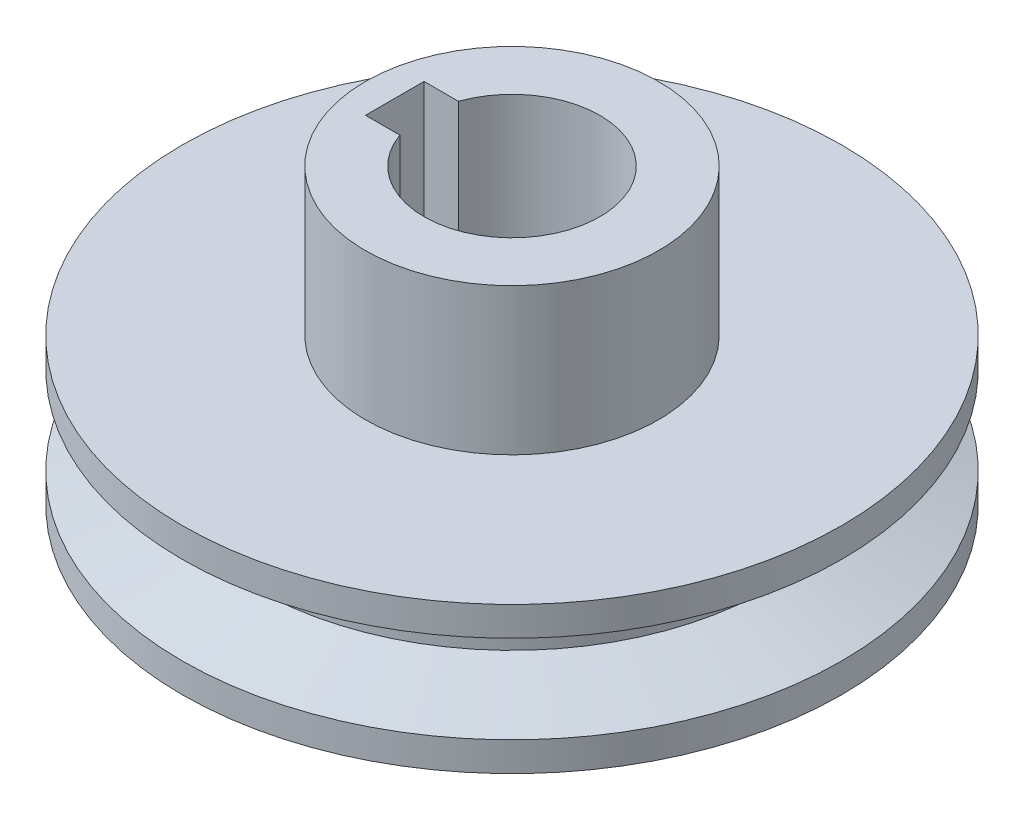
ISO-10303-21;
HEADER;
FILE_DESCRIPTION(('STEP AP214'),'2;1');
FILE_NAME('part.step','',(''),(''),'','','');
FILE_SCHEMA(('AUTOMOTIVE_DESIGN { 1 0 10303 214 1 1 1 1 }'));
ENDSEC;
DATA;
#1=APPLICATION_CONTEXT('core data for automotive mechanical design processes');
#2=APPLICATION_PROTOCOL_DEFINITION('international standard','automotive_design',2000,#1);
#3=PRODUCT_CONTEXT('',#1,'mechanical');
#4=PRODUCT('Part','Part','',(#3));
#5=PRODUCT_RELATED_PRODUCT_CATEGORY('part','',(#4));
#6=PRODUCT_DEFINITION_FORMATION('','',#4);
#7=PRODUCT_DEFINITION_CONTEXT('part definition',#1,'design');
#8=PRODUCT_DEFINITION('design','',#6,#7);
#9=PRODUCT_DEFINITION_SHAPE('','',#8);
#10=(LENGTH_UNIT() NAMED_UNIT(*) SI_UNIT(.MILLI.,.METRE.));
#11=(NAMED_UNIT(*) PLANE_ANGLE_UNIT() SI_UNIT($,.RADIAN.));
#12=(NAMED_UNIT(*) SI_UNIT($,.STERADIAN.) SOLID_ANGLE_UNIT());
#13=UNCERTAINTY_MEASURE_WITH_UNIT(LENGTH_MEASURE(1.E-05),#10,'distance_accuracy_value','');
#14=(GEOMETRIC_REPRESENTATION_CONTEXT(3) GLOBAL_UNCERTAINTY_ASSIGNED_CONTEXT((#13)) GLOBAL_UNIT_ASSIGNED_CONTEXT((#10,
#11,#12)) REPRESENTATION_CONTEXT('',''));
#15=CARTESIAN_POINT('',(0.,0.,0.));
#16=DIRECTION('',(0.,0.,1.));
#17=DIRECTION('',(1.,0.,0.));
#18=AXIS2_PLACEMENT_3D('',#15,#16,#17);
#19=CARTESIAN_POINT('',(22.5,43.956272640616,0.));
#20=DIRECTION('',(0.,1.,0.));
#21=DIRECTION('',(-1.,0.,0.));
#22=AXIS2_PLACEMENT_3D('',#19,#20,#21);
#23=CYLINDRICAL_SURFACE('',#22,45.);
#24=CARTESIAN_POINT('',(22.5,-9.99999999999999,0.));
#25=DIRECTION('',(0.,1.,0.));
#26=DIRECTION('',(-1.,0.,0.));
#27=AXIS2_PLACEMENT_3D('',#24,#25,#26);
#28=CIRCLE('',#27,45.);
#29=CARTESIAN_POINT('',(-22.5,-10.,0.));
#30=VERTEX_POINT('',#29);
#31=EDGE_CURVE('E101',#30,#30,#28,.T.);
#32=ORIENTED_EDGE('',*,*,#31,.T.);
#33=EDGE_LOOP('',(#32));
#34=FACE_BOUND('',#33,.T.);
#35=CARTESIAN_POINT('',(22.5,-5.99999999999999,0.));
#36=DIRECTION('',(0.,1.,0.));
#37=DIRECTION('',(-1.,0.,0.));
#38=AXIS2_PLACEMENT_3D('',#35,#36,#37);
#39=CIRCLE('',#38,45.);
#40=CARTESIAN_POINT('',(-22.5,-6.,0.));
#41=VERTEX_POINT('',#40);
#42=EDGE_CURVE('E124',#41,#41,#39,.T.);
#43=ORIENTED_EDGE('',*,*,#42,.F.);
#44=EDGE_LOOP('',(#43));
#45=FACE_BOUND('',#44,.T.);
#46=ADVANCED_FACE('F33',(#34,#45),#23,.T.);
#47=CARTESIAN_POINT('',(22.5,-2.49999999999999,0.));
#48=DIRECTION('',(0.,-1.,0.));
#49=DIRECTION('',(1.,0.,0.));
#50=AXIS2_PLACEMENT_3D('',#47,#48,#49);
#51=CONICAL_SURFACE('',#50,35.,1.23412150740817);
#52=ORIENTED_EDGE('',*,*,#42,.T.);
#53=EDGE_LOOP('',(#52));
#54=FACE_BOUND('',#53,.T.);
#55=CARTESIAN_POINT('',(22.5,-2.49999999999999,0.));
#56=DIRECTION('',(0.,1.,0.));
#57=DIRECTION('',(-1.,0.,0.));
#58=AXIS2_PLACEMENT_3D('',#55,#56,#57);
#59=CIRCLE('',#58,35.);
#60=CARTESIAN_POINT('',(-12.5,-2.49999999999999,0.));
#61=VERTEX_POINT('',#60);
#62=EDGE_CURVE('E121',#61,#61,#59,.T.);
#63=ORIENTED_EDGE('',*,*,#62,.F.);
#64=EDGE_LOOP('',(#63));
#65=FACE_BOUND('',#64,.T.);
#66=ADVANCED_FACE('F144',(#54,#65),#51,.T.);
#67=CARTESIAN_POINT('',(22.5,43.956272640616,0.));
#68=DIRECTION('',(0.,1.,0.));
#69=DIRECTION('',(-1.,0.,0.));
#70=AXIS2_PLACEMENT_3D('',#67,#68,#69);
#71=CYLINDRICAL_SURFACE('',#70,35.);
#72=ORIENTED_EDGE('',*,*,#62,.T.);
#73=EDGE_LOOP('',(#72));
#74=FACE_BOUND('',#73,.T.);
#75=CARTESIAN_POINT('',(22.5,2.50000000000001,0.));
#76=DIRECTION('',(0.,1.,0.));
#77=DIRECTION('',(-1.,0.,0.));
#78=AXIS2_PLACEMENT_3D('',#75,#76,#77);
#79=CIRCLE('',#78,35.);
#80=CARTESIAN_POINT('',(-12.5,2.50000000000001,0.));
#81=VERTEX_POINT('',#80);
#82=EDGE_CURVE('E118',#81,#81,#79,.T.);
#83=ORIENTED_EDGE('',*,*,#82,.F.);
#84=EDGE_LOOP('',(#83));
#85=FACE_BOUND('',#84,.T.);
#86=ADVANCED_FACE('F149',(#74,#85),#71,.T.);
#87=CARTESIAN_POINT('',(22.5,6.00000000000001,0.));
#88=DIRECTION('',(0.,1.,0.));
#89=DIRECTION('',(-1.,0.,0.));
#90=AXIS2_PLACEMENT_3D('',#87,#88,#89);
#91=CONICAL_SURFACE('',#90,45.,1.23412150740817);
#92=ORIENTED_EDGE('',*,*,#82,.T.);
#93=EDGE_LOOP('',(#92));
#94=FACE_BOUND('',#93,.T.);
#95=CARTESIAN_POINT('',(22.5,6.00000000000001,0.));
#96=DIRECTION('',(0.,1.,0.));
#97=DIRECTION('',(-1.,0.,0.));
#98=AXIS2_PLACEMENT_3D('',#95,#96,#97);
#99=CIRCLE('',#98,45.);
#100=CARTESIAN_POINT('',(-22.5,6.00000000000001,0.));
#101=VERTEX_POINT('',#100);
#102=EDGE_CURVE('E115',#101,#101,#99,.T.);
#103=ORIENTED_EDGE('',*,*,#102,.F.);
#104=EDGE_LOOP('',(#103));
#105=FACE_BOUND('',#104,.T.);
#106=ADVANCED_FACE('F159',(#94,#105),#91,.T.);
#107=CARTESIAN_POINT('',(22.5,43.956272640616,0.));
#108=DIRECTION('',(0.,1.,0.));
#109=DIRECTION('',(-1.,0.,0.));
#110=AXIS2_PLACEMENT_3D('',#107,#108,#109);
#111=CYLINDRICAL_SURFACE('',#110,45.);
#112=ORIENTED_EDGE('',*,*,#102,.T.);
#113=EDGE_LOOP('',(#112));
#114=FACE_BOUND('',#113,.T.);
#115=CARTESIAN_POINT('',(22.5,10.,0.));
#116=DIRECTION('',(0.,1.,0.));
#117=DIRECTION('',(-1.,0.,0.));
#118=AXIS2_PLACEMENT_3D('',#115,#116,#117);
#119=CIRCLE('',#118,45.);
#120=CARTESIAN_POINT('',(-22.5,10.,0.));
#121=VERTEX_POINT('',#120);
#122=EDGE_CURVE('E112',#121,#121,#119,.T.);
#123=ORIENTED_EDGE('',*,*,#122,.F.);
#124=EDGE_LOOP('',(#123));
#125=FACE_BOUND('',#124,.T.);
#126=ADVANCED_FACE('F165',(#114,#125),#111,.T.);
#127=CARTESIAN_POINT('',(2.5,10.,0.));
#128=DIRECTION('',(0.,1.,0.));
#129=DIRECTION('',(-1.,0.,0.));
#130=AXIS2_PLACEMENT_3D('',#127,#128,#129);
#131=PLANE('',#130);
#132=ORIENTED_EDGE('',*,*,#122,.T.);
#133=EDGE_LOOP('',(#132));
#134=FACE_BOUND('',#133,.T.);
#135=CARTESIAN_POINT('',(22.5,10.,0.));
#136=DIRECTION('',(0.,1.,0.));
#137=DIRECTION('',(-1.,0.,0.));
#138=AXIS2_PLACEMENT_3D('',#135,#136,#137);
#139=CIRCLE('',#138,20.);
#140=CARTESIAN_POINT('',(2.5,10.,0.));
#141=VERTEX_POINT('',#140);
#142=EDGE_CURVE('E109',#141,#141,#139,.T.);
#143=ORIENTED_EDGE('',*,*,#142,.F.);
#144=EDGE_LOOP('',(#143));
#145=FACE_BOUND('',#144,.T.);
#146=ADVANCED_FACE('F171',(#134,#145),#131,.T.);
#147=CARTESIAN_POINT('',(22.5,43.956272640616,0.));
#148=DIRECTION('',(0.,1.,0.));
#149=DIRECTION('',(-1.,0.,0.));
#150=AXIS2_PLACEMENT_3D('',#147,#148,#149);
#151=CYLINDRICAL_SURFACE('',#150,20.);
#152=ORIENTED_EDGE('',*,*,#142,.T.);
#153=EDGE_LOOP('',(#152));
#154=FACE_BOUND('',#153,.T.);
#155=CARTESIAN_POINT('',(22.5,30.,0.));
#156=DIRECTION('',(0.,1.,0.));
#157=DIRECTION('',(-1.,0.,0.));
#158=AXIS2_PLACEMENT_3D('',#155,#156,#157);
#159=CIRCLE('',#158,20.);
#160=CARTESIAN_POINT('',(2.5,30.,0.));
#161=VERTEX_POINT('',#160);
#162=EDGE_CURVE('E106',#161,#161,#159,.T.);
#163=ORIENTED_EDGE('',*,*,#162,.F.);
#164=EDGE_LOOP('',(#163));
#165=FACE_BOUND('',#164,.T.);
#166=ADVANCED_FACE('F177',(#154,#165),#151,.T.);
#167=CARTESIAN_POINT('',(2.5,30.,0.));
#168=DIRECTION('',(0.,1.,0.));
#169=DIRECTION('',(-1.,0.,0.));
#170=AXIS2_PLACEMENT_3D('',#167,#168,#169);
#171=PLANE('',#170);
#172=DIRECTION('',(-1.,0.,0.));
#173=VECTOR('',#172,1.);
#174=CARTESIAN_POINT('',(22.5,30.,-4.));
#175=LINE('',#174,#173);
#176=CARTESIAN_POINT('',(11.1862915010152,30.,-4.));
#177=VERTEX_POINT('',#176);
#178=CARTESIAN_POINT('',(6.5,30.,-4.));
#179=VERTEX_POINT('',#178);
#180=EDGE_CURVE('E90',#177,#179,#175,.T.);
#181=ORIENTED_EDGE('',*,*,#180,.F.);
#182=CARTESIAN_POINT('',(22.5,30.,0.));
#183=DIRECTION('',(0.,1.,0.));
#184=DIRECTION('',(-1.,0.,0.));
#185=AXIS2_PLACEMENT_3D('',#182,#183,#184);
#186=CIRCLE('',#185,12.);
#187=CARTESIAN_POINT('',(11.1862915010152,30.,4.));
#188=VERTEX_POINT('',#187);
#189=EDGE_CURVE('E97',#188,#177,#186,.T.);
#190=ORIENTED_EDGE('',*,*,#189,.F.);
#191=DIRECTION('',(1.,0.,0.));
#192=VECTOR('',#191,1.);
#193=CARTESIAN_POINT('',(22.5,30.,4.));
#194=LINE('',#193,#192);
#195=CARTESIAN_POINT('',(6.5,30.,4.));
#196=VERTEX_POINT('',#195);
#197=EDGE_CURVE('E47',#196,#188,#194,.T.);
#198=ORIENTED_EDGE('',*,*,#197,.F.);
#199=DIRECTION('',(0.,0.,1.));
#200=VECTOR('',#199,1.);
#201=CARTESIAN_POINT('',(6.5,30.,4.));
#202=LINE('',#201,#200);
#203=EDGE_CURVE('E78',#179,#196,#202,.T.);
#204=ORIENTED_EDGE('',*,*,#203,.F.);
#205=EDGE_LOOP('',(#181,#190,#198,#204));
#206=FACE_BOUND('',#205,.T.);
#207=ORIENTED_EDGE('',*,*,#162,.T.);
#208=EDGE_LOOP('',(#207));
#209=FACE_BOUND('',#208,.T.);
#210=ADVANCED_FACE('F131',(#206,#209),#171,.T.);
#211=CARTESIAN_POINT('',(22.5,-10.,0.));
#212=DIRECTION('',(0.,-1.,0.));
#213=DIRECTION('',(1.,0.,0.));
#214=AXIS2_PLACEMENT_3D('',#211,#212,#213);
#215=PLANE('',#214);
#216=DIRECTION('',(-1.,0.,0.));
#217=VECTOR('',#216,1.);
#218=CARTESIAN_POINT('',(22.5,-10.,-4.));
#219=LINE('',#218,#217);
#220=CARTESIAN_POINT('',(11.1862915010152,-10.,-4.));
#221=VERTEX_POINT('',#220);
#222=CARTESIAN_POINT('',(6.5,-10.,-4.));
#223=VERTEX_POINT('',#222);
#224=EDGE_CURVE('E80',#221,#223,#219,.T.);
#225=ORIENTED_EDGE('',*,*,#224,.T.);
#226=DIRECTION('',(0.,0.,1.));
#227=VECTOR('',#226,1.);
#228=CARTESIAN_POINT('',(6.5,-10.,4.));
#229=LINE('',#228,#227);
#230=CARTESIAN_POINT('',(6.5,-10.,4.));
#231=VERTEX_POINT('',#230);
#232=EDGE_CURVE('E75',#223,#231,#229,.T.);
#233=ORIENTED_EDGE('',*,*,#232,.T.);
#234=DIRECTION('',(1.,0.,0.));
#235=VECTOR('',#234,1.);
#236=CARTESIAN_POINT('',(22.5,-10.,4.));
#237=LINE('',#236,#235);
#238=CARTESIAN_POINT('',(11.1862915010152,-10.,4.));
#239=VERTEX_POINT('',#238);
#240=EDGE_CURVE('E82',#231,#239,#237,.T.);
#241=ORIENTED_EDGE('',*,*,#240,.T.);
#242=CARTESIAN_POINT('',(22.5,-10.,0.));
#243=DIRECTION('',(0.,1.,0.));
#244=DIRECTION('',(-1.,0.,0.));
#245=AXIS2_PLACEMENT_3D('',#242,#243,#244);
#246=CIRCLE('',#245,12.);
#247=EDGE_CURVE('E99',#239,#221,#246,.T.);
#248=ORIENTED_EDGE('',*,*,#247,.T.);
#249=EDGE_LOOP('',(#225,#233,#241,#248));
#250=FACE_BOUND('',#249,.T.);
#251=ORIENTED_EDGE('',*,*,#31,.F.);
#252=EDGE_LOOP('',(#251));
#253=FACE_BOUND('',#252,.T.);
#254=ADVANCED_FACE('F88',(#250,#253),#215,.T.);
#255=CARTESIAN_POINT('',(22.5,-10.,0.));
#256=DIRECTION('',(0.,1.,0.));
#257=DIRECTION('',(-1.,0.,0.));
#258=AXIS2_PLACEMENT_3D('',#255,#256,#257);
#259=CYLINDRICAL_SURFACE('',#258,12.);
#260=ORIENTED_EDGE('',*,*,#189,.T.);
#261=DIRECTION('',(0.,1.,0.));
#262=VECTOR('',#261,1.);
#263=CARTESIAN_POINT('',(11.1862915010152,-10.,-4.));
#264=LINE('',#263,#262);
#265=EDGE_CURVE('E11',#177,#221,#264,.F.);
#266=ORIENTED_EDGE('',*,*,#265,.T.);
#267=ORIENTED_EDGE('',*,*,#247,.F.);
#268=DIRECTION('',(0.,1.,0.));
#269=VECTOR('',#268,1.);
#270=CARTESIAN_POINT('',(11.1862915010152,-10.,4.));
#271=LINE('',#270,#269);
#272=EDGE_CURVE('E40',#239,#188,#271,.T.);
#273=ORIENTED_EDGE('',*,*,#272,.T.);
#274=EDGE_LOOP('',(#260,#266,#267,#273));
#275=FACE_BOUND('',#274,.T.);
#276=ADVANCED_FACE('F128',(#275),#259,.F.);
#277=CARTESIAN_POINT('',(22.5,-10.,-4.));
#278=DIRECTION('',(0.,0.,-1.));
#279=DIRECTION('',(-1.,0.,0.));
#280=AXIS2_PLACEMENT_3D('',#277,#278,#279);
#281=PLANE('',#280);
#282=ORIENTED_EDGE('',*,*,#180,.T.);
#283=DIRECTION('',(0.,1.,0.));
#284=VECTOR('',#283,1.);
#285=CARTESIAN_POINT('',(6.5,-10.,-4.));
#286=LINE('',#285,#284);
#287=EDGE_CURVE('E79',#223,#179,#286,.T.);
#288=ORIENTED_EDGE('',*,*,#287,.F.);
#289=ORIENTED_EDGE('',*,*,#224,.F.);
#290=ORIENTED_EDGE('',*,*,#265,.F.);
#291=EDGE_LOOP('',(#282,#288,#289,#290));
#292=FACE_BOUND('',#291,.T.);
#293=ADVANCED_FACE('F134',(#292),#281,.F.);
#294=CARTESIAN_POINT('',(22.5,-10.,4.));
#295=DIRECTION('',(0.,0.,1.));
#296=DIRECTION('',(1.,0.,0.));
#297=AXIS2_PLACEMENT_3D('',#294,#295,#296);
#298=PLANE('',#297);
#299=ORIENTED_EDGE('',*,*,#240,.F.);
#300=DIRECTION('',(0.,1.,0.));
#301=VECTOR('',#300,1.);
#302=CARTESIAN_POINT('',(6.5,-10.,4.));
#303=LINE('',#302,#301);
#304=EDGE_CURVE('E71',#231,#196,#303,.T.);
#305=ORIENTED_EDGE('',*,*,#304,.T.);
#306=ORIENTED_EDGE('',*,*,#197,.T.);
#307=ORIENTED_EDGE('',*,*,#272,.F.);
#308=EDGE_LOOP('',(#299,#305,#306,#307));
#309=FACE_BOUND('',#308,.T.);
#310=ADVANCED_FACE('F83',(#309),#298,.F.);
#311=CARTESIAN_POINT('',(6.5,-10.,4.));
#312=DIRECTION('',(-1.,0.,0.));
#313=DIRECTION('',(0.,-1.,0.));
#314=AXIS2_PLACEMENT_3D('',#311,#312,#313);
#315=PLANE('',#314);
#316=ORIENTED_EDGE('',*,*,#203,.T.);
#317=ORIENTED_EDGE('',*,*,#304,.F.);
#318=ORIENTED_EDGE('',*,*,#232,.F.);
#319=ORIENTED_EDGE('',*,*,#287,.T.);
#320=EDGE_LOOP('',(#316,#317,#318,#319));
#321=FACE_BOUND('',#320,.T.);
#322=ADVANCED_FACE('F72',(#321),#315,.F.);
#323=CLOSED_SHELL('',(#46,#66,#86,#106,#126,#146,#166,#210,#254,#276,#293,#310,#322));
#324=MANIFOLD_SOLID_BREP('B2',#323);
#325=ADVANCED_BREP_SHAPE_REPRESENTATION('',(#18,#324),#14);
#326=SHAPE_DEFINITION_REPRESENTATION(#9,#325);
ENDSEC;
END-ISO-10303-21;
